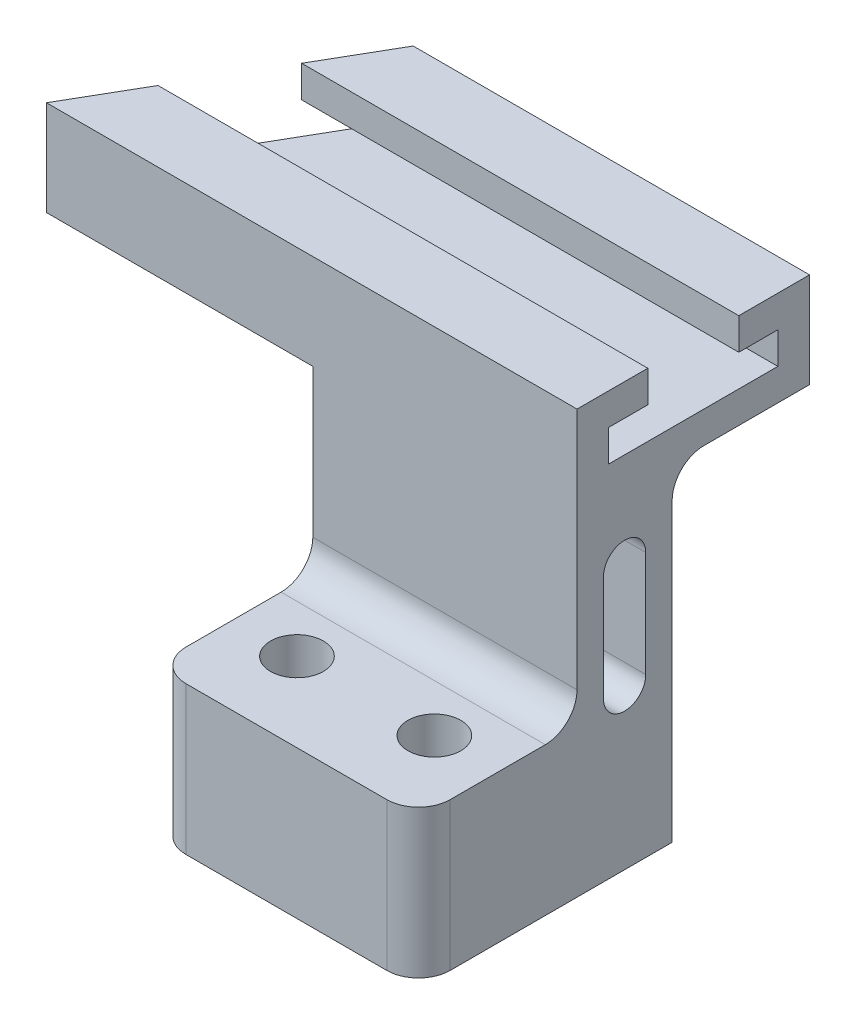
ISO-10303-21;
HEADER;
FILE_DESCRIPTION(('STEP AP214'),'2;1');
FILE_NAME('part.step','',(''),(''),'','','');
FILE_SCHEMA(('AUTOMOTIVE_DESIGN { 1 0 10303 214 1 1 1 1 }'));
ENDSEC;
DATA;
#1=APPLICATION_CONTEXT('core data for automotive mechanical design processes');
#2=APPLICATION_PROTOCOL_DEFINITION('international standard','automotive_design',2000,#1);
#3=PRODUCT_CONTEXT('',#1,'mechanical');
#4=PRODUCT('Part','Part','',(#3));
#5=PRODUCT_RELATED_PRODUCT_CATEGORY('part','',(#4));
#6=PRODUCT_DEFINITION_FORMATION('','',#4);
#7=PRODUCT_DEFINITION_CONTEXT('part definition',#1,'design');
#8=PRODUCT_DEFINITION('design','',#6,#7);
#9=PRODUCT_DEFINITION_SHAPE('','',#8);
#10=(LENGTH_UNIT() NAMED_UNIT(*) SI_UNIT(.MILLI.,.METRE.));
#11=(NAMED_UNIT(*) PLANE_ANGLE_UNIT() SI_UNIT($,.RADIAN.));
#12=(NAMED_UNIT(*) SI_UNIT($,.STERADIAN.) SOLID_ANGLE_UNIT());
#13=UNCERTAINTY_MEASURE_WITH_UNIT(LENGTH_MEASURE(1.E-05),#10,'distance_accuracy_value','');
#14=(GEOMETRIC_REPRESENTATION_CONTEXT(3) GLOBAL_UNCERTAINTY_ASSIGNED_CONTEXT((#13)) GLOBAL_UNIT_ASSIGNED_CONTEXT((#10,
#11,#12)) REPRESENTATION_CONTEXT('',''));
#15=CARTESIAN_POINT('',(0.,0.,0.));
#16=DIRECTION('',(0.,0.,1.));
#17=DIRECTION('',(1.,0.,0.));
#18=AXIS2_PLACEMENT_3D('',#15,#16,#17);
#19=CARTESIAN_POINT('',(-110.,80.,-30.));
#20=DIRECTION('',(0.,0.,1.));
#21=DIRECTION('',(0.,-1.,0.));
#22=AXIS2_PLACEMENT_3D('',#19,#20,#21);
#23=PLANE('',#22);
#24=DIRECTION('',(0.,1.,0.));
#25=VECTOR('',#24,1.);
#26=CARTESIAN_POINT('',(-50.,80.,-30.));
#27=LINE('',#26,#25);
#28=CARTESIAN_POINT('',(-50.,34.,-30.));
#29=VERTEX_POINT('',#28);
#30=CARTESIAN_POINT('',(-50.,62.,-30.));
#31=VERTEX_POINT('',#30);
#32=EDGE_CURVE('E271',#29,#31,#27,.T.);
#33=ORIENTED_EDGE('',*,*,#32,.F.);
#34=DIRECTION('',(1.,0.,0.));
#35=VECTOR('',#34,1.);
#36=CARTESIAN_POINT('',(-110.,34.,-30.));
#37=LINE('',#36,#35);
#38=CARTESIAN_POINT('',(0.,34.,-30.));
#39=VERTEX_POINT('',#38);
#40=EDGE_CURVE('E386',#29,#39,#37,.T.);
#41=ORIENTED_EDGE('',*,*,#40,.T.);
#42=DIRECTION('',(0.,-1.,0.));
#43=VECTOR('',#42,1.);
#44=CARTESIAN_POINT('',(0.,80.,-30.));
#45=LINE('',#44,#43);
#46=CARTESIAN_POINT('',(0.,80.,-30.));
#47=VERTEX_POINT('',#46);
#48=EDGE_CURVE('E381',#47,#39,#45,.T.);
#49=ORIENTED_EDGE('',*,*,#48,.F.);
#50=DIRECTION('',(1.,0.,0.));
#51=VECTOR('',#50,1.);
#52=CARTESIAN_POINT('',(-110.,80.,-30.));
#53=LINE('',#52,#51);
#54=CARTESIAN_POINT('',(-100.403411844344,80.,-30.));
#55=VERTEX_POINT('',#54);
#56=EDGE_CURVE('E388',#55,#47,#53,.T.);
#57=ORIENTED_EDGE('',*,*,#56,.F.);
#58=DIRECTION('',(0.,1.,0.));
#59=VECTOR('',#58,1.);
#60=CARTESIAN_POINT('',(-100.403411844344,0.,-30.));
#61=LINE('',#60,#59);
#62=CARTESIAN_POINT('',(-100.403411844344,62.,-30.));
#63=VERTEX_POINT('',#62);
#64=EDGE_CURVE('E294',#63,#55,#61,.T.);
#65=ORIENTED_EDGE('',*,*,#64,.F.);
#66=DIRECTION('',(-1.,0.,0.));
#67=VECTOR('',#66,1.);
#68=CARTESIAN_POINT('',(-110.,62.,-30.));
#69=LINE('',#68,#67);
#70=EDGE_CURVE('E222',#31,#63,#69,.T.);
#71=ORIENTED_EDGE('',*,*,#70,.F.);
#72=EDGE_LOOP('',(#33,#41,#49,#57,#65,#71));
#73=FACE_BOUND('',#72,.T.);
#74=ADVANCED_FACE('F32',(#73),#23,.T.);
#75=CARTESIAN_POINT('',(-110.,80.,-43.3846153846154));
#76=DIRECTION('',(0.,1.,0.));
#77=DIRECTION('',(0.,0.,1.));
#78=AXIS2_PLACEMENT_3D('',#75,#76,#77);
#79=PLANE('',#78);
#80=DIRECTION('',(1.,0.,0.));
#81=VECTOR('',#80,1.);
#82=CARTESIAN_POINT('',(-110.,80.,-43.3846153846154));
#83=LINE('',#82,#81);
#84=CARTESIAN_POINT('',(-92.6758005490364,80.,-43.3846153846154));
#85=VERTEX_POINT('',#84);
#86=CARTESIAN_POINT('',(0.,80.,-43.3846153846154));
#87=VERTEX_POINT('',#86);
#88=EDGE_CURVE('E390',#85,#87,#83,.T.);
#89=ORIENTED_EDGE('',*,*,#88,.F.);
#90=DIRECTION('',(-0.500000000000004,0.,0.866025403784436));
#91=VECTOR('',#90,1.);
#92=CARTESIAN_POINT('',(-88.2929399400241,80.,-50.9759526419169));
#93=LINE('',#92,#91);
#94=EDGE_CURVE('E290',#85,#55,#93,.T.);
#95=ORIENTED_EDGE('',*,*,#94,.T.);
#96=ORIENTED_EDGE('',*,*,#56,.T.);
#97=DIRECTION('',(0.,0.,1.));
#98=VECTOR('',#97,1.);
#99=CARTESIAN_POINT('',(0.,80.,-43.3846153846154));
#100=LINE('',#99,#98);
#101=EDGE_CURVE('E378',#87,#47,#100,.T.);
#102=ORIENTED_EDGE('',*,*,#101,.F.);
#103=EDGE_LOOP('',(#89,#95,#96,#102));
#104=FACE_BOUND('',#103,.T.);
#105=ADVANCED_FACE('F457',(#104),#79,.T.);
#106=CARTESIAN_POINT('',(-110.,74.,-43.3846153846154));
#107=DIRECTION('',(0.,0.,-1.));
#108=DIRECTION('',(-1.,0.,0.));
#109=AXIS2_PLACEMENT_3D('',#106,#107,#108);
#110=PLANE('',#109);
#111=DIRECTION('',(1.,0.,0.));
#112=VECTOR('',#111,1.);
#113=CARTESIAN_POINT('',(-110.,74.,-43.3846153846154));
#114=LINE('',#113,#112);
#115=CARTESIAN_POINT('',(-92.6758005490364,74.,-43.3846153846154));
#116=VERTEX_POINT('',#115);
#117=CARTESIAN_POINT('',(0.,74.,-43.3846153846154));
#118=VERTEX_POINT('',#117);
#119=EDGE_CURVE('E392',#116,#118,#114,.T.);
#120=ORIENTED_EDGE('',*,*,#119,.F.);
#121=DIRECTION('',(0.,1.,0.));
#122=VECTOR('',#121,1.);
#123=CARTESIAN_POINT('',(-92.6758005490364,74.,-43.3846153846154));
#124=LINE('',#123,#122);
#125=EDGE_CURVE('E320',#116,#85,#124,.T.);
#126=ORIENTED_EDGE('',*,*,#125,.T.);
#127=ORIENTED_EDGE('',*,*,#88,.T.);
#128=DIRECTION('',(0.,1.,0.));
#129=VECTOR('',#128,1.);
#130=CARTESIAN_POINT('',(0.,74.,-43.3846153846154));
#131=LINE('',#130,#129);
#132=EDGE_CURVE('E375',#118,#87,#131,.T.);
#133=ORIENTED_EDGE('',*,*,#132,.F.);
#134=EDGE_LOOP('',(#120,#126,#127,#133));
#135=FACE_BOUND('',#134,.T.);
#136=ADVANCED_FACE('F452',(#135),#110,.T.);
#137=CARTESIAN_POINT('',(-110.,74.,-36.));
#138=DIRECTION('',(0.,-1.,0.));
#139=DIRECTION('',(0.,0.,-1.));
#140=AXIS2_PLACEMENT_3D('',#137,#138,#139);
#141=PLANE('',#140);
#142=DIRECTION('',(1.,0.,0.));
#143=VECTOR('',#142,1.);
#144=CARTESIAN_POINT('',(-110.,74.,-36.));
#145=LINE('',#144,#143);
#146=CARTESIAN_POINT('',(-96.939310229206,74.,-36.));
#147=VERTEX_POINT('',#146);
#148=CARTESIAN_POINT('',(0.,74.,-36.));
#149=VERTEX_POINT('',#148);
#150=EDGE_CURVE('E394',#147,#149,#145,.T.);
#151=ORIENTED_EDGE('',*,*,#150,.F.);
#152=DIRECTION('',(0.500000000000004,0.,-0.866025403784436));
#153=VECTOR('',#152,1.);
#154=CARTESIAN_POINT('',(-100.204482671905,74.,-30.3445554337724));
#155=LINE('',#154,#153);
#156=EDGE_CURVE('E317',#147,#116,#155,.T.);
#157=ORIENTED_EDGE('',*,*,#156,.T.);
#158=ORIENTED_EDGE('',*,*,#119,.T.);
#159=DIRECTION('',(0.,0.,-1.));
#160=VECTOR('',#159,1.);
#161=CARTESIAN_POINT('',(0.,74.,-36.));
#162=LINE('',#161,#160);
#163=EDGE_CURVE('E372',#149,#118,#162,.T.);
#164=ORIENTED_EDGE('',*,*,#163,.F.);
#165=EDGE_LOOP('',(#151,#157,#158,#164));
#166=FACE_BOUND('',#165,.T.);
#167=ADVANCED_FACE('F448',(#166),#141,.T.);
#168=CARTESIAN_POINT('',(-110.,68.,-36.));
#169=DIRECTION('',(0.,0.,-1.));
#170=DIRECTION('',(-1.,0.,0.));
#171=AXIS2_PLACEMENT_3D('',#168,#169,#170);
#172=PLANE('',#171);
#173=DIRECTION('',(1.,0.,0.));
#174=VECTOR('',#173,1.);
#175=CARTESIAN_POINT('',(-110.,68.,-36.));
#176=LINE('',#175,#174);
#177=CARTESIAN_POINT('',(-96.939310229206,68.,-36.));
#178=VERTEX_POINT('',#177);
#179=CARTESIAN_POINT('',(0.,68.,-36.));
#180=VERTEX_POINT('',#179);
#181=EDGE_CURVE('E396',#178,#180,#176,.T.);
#182=ORIENTED_EDGE('',*,*,#181,.F.);
#183=DIRECTION('',(0.,1.,0.));
#184=VECTOR('',#183,1.);
#185=CARTESIAN_POINT('',(-96.939310229206,68.,-36.));
#186=LINE('',#185,#184);
#187=EDGE_CURVE('E314',#178,#147,#186,.T.);
#188=ORIENTED_EDGE('',*,*,#187,.T.);
#189=ORIENTED_EDGE('',*,*,#150,.T.);
#190=DIRECTION('',(0.,1.,0.));
#191=VECTOR('',#190,1.);
#192=CARTESIAN_POINT('',(0.,68.,-36.));
#193=LINE('',#192,#191);
#194=EDGE_CURVE('E369',#180,#149,#193,.T.);
#195=ORIENTED_EDGE('',*,*,#194,.F.);
#196=EDGE_LOOP('',(#182,#188,#189,#195));
#197=FACE_BOUND('',#196,.T.);
#198=ADVANCED_FACE('F445',(#197),#172,.T.);
#199=CARTESIAN_POINT('',(-110.,68.,-68.));
#200=DIRECTION('',(0.,1.,0.));
#201=DIRECTION('',(0.,0.,1.));
#202=AXIS2_PLACEMENT_3D('',#199,#200,#201);
#203=PLANE('',#202);
#204=DIRECTION('',(1.,0.,0.));
#205=VECTOR('',#204,1.);
#206=CARTESIAN_POINT('',(-110.,68.,-68.));
#207=LINE('',#206,#205);
#208=CARTESIAN_POINT('',(-78.4641016151378,68.,-68.));
#209=VERTEX_POINT('',#208);
#210=CARTESIAN_POINT('',(0.,68.,-68.));
#211=VERTEX_POINT('',#210);
#212=EDGE_CURVE('E398',#209,#211,#207,.T.);
#213=ORIENTED_EDGE('',*,*,#212,.F.);
#214=DIRECTION('',(-0.500000000000004,0.,0.866025403784436));
#215=VECTOR('',#214,1.);
#216=CARTESIAN_POINT('',(-86.3480762113535,68.,-54.3445554337723));
#217=LINE('',#216,#215);
#218=EDGE_CURVE('E311',#209,#178,#217,.T.);
#219=ORIENTED_EDGE('',*,*,#218,.T.);
#220=ORIENTED_EDGE('',*,*,#181,.T.);
#221=DIRECTION('',(0.,0.,1.));
#222=VECTOR('',#221,1.);
#223=CARTESIAN_POINT('',(0.,68.,-68.));
#224=LINE('',#223,#222);
#225=EDGE_CURVE('E366',#211,#180,#224,.T.);
#226=ORIENTED_EDGE('',*,*,#225,.F.);
#227=EDGE_LOOP('',(#213,#219,#220,#226));
#228=FACE_BOUND('',#227,.T.);
#229=ADVANCED_FACE('F440',(#228),#203,.T.);
#230=CARTESIAN_POINT('',(-110.,74.,-68.));
#231=DIRECTION('',(0.,0.,1.));
#232=DIRECTION('',(1.,0.,0.));
#233=AXIS2_PLACEMENT_3D('',#230,#231,#232);
#234=PLANE('',#233);
#235=DIRECTION('',(1.,0.,0.));
#236=VECTOR('',#235,1.);
#237=CARTESIAN_POINT('',(-110.,74.,-68.));
#238=LINE('',#237,#236);
#239=CARTESIAN_POINT('',(-78.4641016151378,74.,-68.));
#240=VERTEX_POINT('',#239);
#241=CARTESIAN_POINT('',(0.,74.,-68.));
#242=VERTEX_POINT('',#241);
#243=EDGE_CURVE('E400',#240,#242,#238,.T.);
#244=ORIENTED_EDGE('',*,*,#243,.F.);
#245=DIRECTION('',(0.,-1.,0.));
#246=VECTOR('',#245,1.);
#247=CARTESIAN_POINT('',(-78.4641016151378,74.,-68.));
#248=LINE('',#247,#246);
#249=EDGE_CURVE('E308',#240,#209,#248,.T.);
#250=ORIENTED_EDGE('',*,*,#249,.T.);
#251=ORIENTED_EDGE('',*,*,#212,.T.);
#252=DIRECTION('',(0.,-1.,0.));
#253=VECTOR('',#252,1.);
#254=CARTESIAN_POINT('',(0.,74.,-68.));
#255=LINE('',#254,#253);
#256=EDGE_CURVE('E363',#242,#211,#255,.T.);
#257=ORIENTED_EDGE('',*,*,#256,.F.);
#258=EDGE_LOOP('',(#244,#250,#251,#257));
#259=FACE_BOUND('',#258,.T.);
#260=ADVANCED_FACE('F436',(#259),#234,.T.);
#261=CARTESIAN_POINT('',(-110.,74.,-60.6153846153846));
#262=DIRECTION('',(0.,-1.,0.));
#263=DIRECTION('',(0.,0.,-1.));
#264=AXIS2_PLACEMENT_3D('',#261,#262,#263);
#265=PLANE('',#264);
#266=DIRECTION('',(1.,0.,0.));
#267=VECTOR('',#266,1.);
#268=CARTESIAN_POINT('',(-110.,74.,-60.6153846153846));
#269=LINE('',#268,#267);
#270=CARTESIAN_POINT('',(-82.7276112953074,74.,-60.6153846153846));
#271=VERTEX_POINT('',#270);
#272=CARTESIAN_POINT('',(0.,74.,-60.6153846153846));
#273=VERTEX_POINT('',#272);
#274=EDGE_CURVE('E402',#271,#273,#269,.T.);
#275=ORIENTED_EDGE('',*,*,#274,.F.);
#276=DIRECTION('',(0.500000000000004,0.,-0.866025403784436));
#277=VECTOR('',#276,1.);
#278=CARTESIAN_POINT('',(-89.5457084714807,74.,-48.8060938953107));
#279=LINE('',#278,#277);
#280=EDGE_CURVE('E305',#271,#240,#279,.T.);
#281=ORIENTED_EDGE('',*,*,#280,.T.);
#282=ORIENTED_EDGE('',*,*,#243,.T.);
#283=DIRECTION('',(0.,0.,-1.));
#284=VECTOR('',#283,1.);
#285=CARTESIAN_POINT('',(0.,74.,-60.6153846153846));
#286=LINE('',#285,#284);
#287=EDGE_CURVE('E360',#273,#242,#286,.T.);
#288=ORIENTED_EDGE('',*,*,#287,.F.);
#289=EDGE_LOOP('',(#275,#281,#282,#288));
#290=FACE_BOUND('',#289,.T.);
#291=ADVANCED_FACE('F433',(#290),#265,.T.);
#292=CARTESIAN_POINT('',(-110.,80.,-60.6153846153846));
#293=DIRECTION('',(0.,0.,1.));
#294=DIRECTION('',(1.,0.,0.));
#295=AXIS2_PLACEMENT_3D('',#292,#293,#294);
#296=PLANE('',#295);
#297=DIRECTION('',(1.,0.,0.));
#298=VECTOR('',#297,1.);
#299=CARTESIAN_POINT('',(-110.,80.,-60.6153846153846));
#300=LINE('',#299,#298);
#301=CARTESIAN_POINT('',(-82.7276112953074,80.,-60.6153846153846));
#302=VERTEX_POINT('',#301);
#303=CARTESIAN_POINT('',(0.,80.,-60.6153846153846));
#304=VERTEX_POINT('',#303);
#305=EDGE_CURVE('E404',#302,#304,#300,.T.);
#306=ORIENTED_EDGE('',*,*,#305,.F.);
#307=DIRECTION('',(0.,-1.,0.));
#308=VECTOR('',#307,1.);
#309=CARTESIAN_POINT('',(-82.7276112953074,80.,-60.6153846153846));
#310=LINE('',#309,#308);
#311=EDGE_CURVE('E302',#302,#271,#310,.T.);
#312=ORIENTED_EDGE('',*,*,#311,.T.);
#313=ORIENTED_EDGE('',*,*,#274,.T.);
#314=DIRECTION('',(0.,-1.,0.));
#315=VECTOR('',#314,1.);
#316=CARTESIAN_POINT('',(0.,80.,-60.6153846153846));
#317=LINE('',#316,#315);
#318=EDGE_CURVE('E357',#304,#273,#317,.T.);
#319=ORIENTED_EDGE('',*,*,#318,.F.);
#320=EDGE_LOOP('',(#306,#312,#313,#319));
#321=FACE_BOUND('',#320,.T.);
#322=ADVANCED_FACE('F428',(#321),#296,.T.);
#323=CARTESIAN_POINT('',(-110.,80.,-74.));
#324=DIRECTION('',(0.,1.,0.));
#325=DIRECTION('',(0.,0.,1.));
#326=AXIS2_PLACEMENT_3D('',#323,#324,#325);
#327=PLANE('',#326);
#328=DIRECTION('',(1.,0.,0.));
#329=VECTOR('',#328,1.);
#330=CARTESIAN_POINT('',(-110.,80.,-74.));
#331=LINE('',#330,#329);
#332=CARTESIAN_POINT('',(-75.,80.,-74.));
#333=VERTEX_POINT('',#332);
#334=CARTESIAN_POINT('',(0.,80.,-74.));
#335=VERTEX_POINT('',#334);
#336=EDGE_CURVE('E406',#333,#335,#331,.T.);
#337=ORIENTED_EDGE('',*,*,#336,.F.);
#338=EDGE_CURVE('E291',#333,#302,#93,.T.);
#339=ORIENTED_EDGE('',*,*,#338,.T.);
#340=ORIENTED_EDGE('',*,*,#305,.T.);
#341=DIRECTION('',(0.,0.,1.));
#342=VECTOR('',#341,1.);
#343=CARTESIAN_POINT('',(0.,80.,-74.));
#344=LINE('',#343,#342);
#345=EDGE_CURVE('E354',#335,#304,#344,.T.);
#346=ORIENTED_EDGE('',*,*,#345,.F.);
#347=EDGE_LOOP('',(#337,#339,#340,#346));
#348=FACE_BOUND('',#347,.T.);
#349=ADVANCED_FACE('F424',(#348),#327,.T.);
#350=CARTESIAN_POINT('',(-110.,62.,-74.));
#351=DIRECTION('',(0.,0.,-1.));
#352=DIRECTION('',(-1.,0.,0.));
#353=AXIS2_PLACEMENT_3D('',#350,#351,#352);
#354=PLANE('',#353);
#355=DIRECTION('',(1.,0.,0.));
#356=VECTOR('',#355,1.);
#357=CARTESIAN_POINT('',(-110.,62.,-74.));
#358=LINE('',#357,#356);
#359=CARTESIAN_POINT('',(-75.,62.,-74.));
#360=VERTEX_POINT('',#359);
#361=CARTESIAN_POINT('',(0.,62.,-74.));
#362=VERTEX_POINT('',#361);
#363=EDGE_CURVE('E408',#360,#362,#358,.T.);
#364=ORIENTED_EDGE('',*,*,#363,.F.);
#365=DIRECTION('',(0.,1.,0.));
#366=VECTOR('',#365,1.);
#367=CARTESIAN_POINT('',(-75.,0.,-74.));
#368=LINE('',#367,#366);
#369=EDGE_CURVE('E295',#360,#333,#368,.T.);
#370=ORIENTED_EDGE('',*,*,#369,.T.);
#371=ORIENTED_EDGE('',*,*,#336,.T.);
#372=DIRECTION('',(0.,1.,0.));
#373=VECTOR('',#372,1.);
#374=CARTESIAN_POINT('',(0.,62.,-74.));
#375=LINE('',#374,#373);
#376=EDGE_CURVE('E351',#362,#335,#375,.T.);
#377=ORIENTED_EDGE('',*,*,#376,.F.);
#378=EDGE_LOOP('',(#364,#370,#371,#377));
#379=FACE_BOUND('',#378,.T.);
#380=ADVANCED_FACE('F421',(#379),#354,.T.);
#381=CARTESIAN_POINT('',(-110.,62.,-54.));
#382=DIRECTION('',(0.,-1.,0.));
#383=DIRECTION('',(0.,0.,-1.));
#384=AXIS2_PLACEMENT_3D('',#381,#382,#383);
#385=PLANE('',#384);
#386=DIRECTION('',(1.,0.,0.));
#387=VECTOR('',#386,1.);
#388=CARTESIAN_POINT('',(-110.,62.,-54.));
#389=LINE('',#388,#387);
#390=CARTESIAN_POINT('',(-50.,62.,-54.));
#391=VERTEX_POINT('',#390);
#392=CARTESIAN_POINT('',(0.,62.,-54.));
#393=VERTEX_POINT('',#392);
#394=EDGE_CURVE('E231',#391,#393,#389,.T.);
#395=ORIENTED_EDGE('',*,*,#394,.F.);
#396=DIRECTION('',(0.,0.,1.));
#397=VECTOR('',#396,1.);
#398=CARTESIAN_POINT('',(-50.,62.,-74.));
#399=LINE('',#398,#397);
#400=EDGE_CURVE('E223',#391,#31,#399,.T.);
#401=ORIENTED_EDGE('',*,*,#400,.T.);
#402=ORIENTED_EDGE('',*,*,#70,.T.);
#403=DIRECTION('',(0.500000000000004,0.,-0.866025403784436));
#404=VECTOR('',#403,1.);
#405=CARTESIAN_POINT('',(-92.4102540378446,62.,-43.8445554337723));
#406=LINE('',#405,#404);
#407=EDGE_CURVE('E298',#63,#360,#406,.T.);
#408=ORIENTED_EDGE('',*,*,#407,.T.);
#409=ORIENTED_EDGE('',*,*,#363,.T.);
#410=DIRECTION('',(0.,0.,-1.));
#411=VECTOR('',#410,1.);
#412=CARTESIAN_POINT('',(0.,62.,-54.));
#413=LINE('',#412,#411);
#414=EDGE_CURVE('E348',#393,#362,#413,.T.);
#415=ORIENTED_EDGE('',*,*,#414,.F.);
#416=EDGE_LOOP('',(#395,#401,#402,#408,#409,#415));
#417=FACE_BOUND('',#416,.T.);
#418=ADVANCED_FACE('F416',(#417),#385,.T.);
#419=CARTESIAN_POINT('',(-110.,56.,-54.));
#420=DIRECTION('',(1.,0.,0.));
#421=DIRECTION('',(0.,0.,-1.));
#422=AXIS2_PLACEMENT_3D('',#419,#420,#421);
#423=CYLINDRICAL_SURFACE('',#422,6.);
#424=CARTESIAN_POINT('',(-50.,56.,-54.));
#425=DIRECTION('',(1.,0.,0.));
#426=DIRECTION('',(0.,0.,-1.));
#427=AXIS2_PLACEMENT_3D('',#424,#425,#426);
#428=CIRCLE('',#427,6.);
#429=CARTESIAN_POINT('',(-50.,56.,-48.));
#430=VERTEX_POINT('',#429);
#431=EDGE_CURVE('E207',#391,#430,#428,.T.);
#432=ORIENTED_EDGE('',*,*,#431,.F.);
#433=ORIENTED_EDGE('',*,*,#394,.T.);
#434=CARTESIAN_POINT('',(0.,56.,-54.));
#435=DIRECTION('',(-1.,0.,0.));
#436=DIRECTION('',(0.,0.,1.));
#437=AXIS2_PLACEMENT_3D('',#434,#435,#436);
#438=CIRCLE('',#437,6.);
#439=CARTESIAN_POINT('',(0.,56.,-48.));
#440=VERTEX_POINT('',#439);
#441=EDGE_CURVE('E345',#440,#393,#438,.T.);
#442=ORIENTED_EDGE('',*,*,#441,.F.);
#443=DIRECTION('',(1.,0.,0.));
#444=VECTOR('',#443,1.);
#445=CARTESIAN_POINT('',(-110.,56.,-48.));
#446=LINE('',#445,#444);
#447=EDGE_CURVE('E228',#430,#440,#446,.T.);
#448=ORIENTED_EDGE('',*,*,#447,.F.);
#449=EDGE_LOOP('',(#432,#433,#442,#448));
#450=FACE_BOUND('',#449,.T.);
#451=ADVANCED_FACE('F413',(#450),#423,.F.);
#452=CARTESIAN_POINT('',(-110.,0.,-48.));
#453=DIRECTION('',(0.,0.,-1.));
#454=DIRECTION('',(-1.,0.,0.));
#455=AXIS2_PLACEMENT_3D('',#452,#453,#454);
#456=PLANE('',#455);
#457=DIRECTION('',(0.,-1.,0.));
#458=VECTOR('',#457,1.);
#459=CARTESIAN_POINT('',(-50.,0.,-48.));
#460=LINE('',#459,#458);
#461=CARTESIAN_POINT('',(-50.,0.,-48.));
#462=VERTEX_POINT('',#461);
#463=EDGE_CURVE('E201',#430,#462,#460,.T.);
#464=ORIENTED_EDGE('',*,*,#463,.F.);
#465=ORIENTED_EDGE('',*,*,#447,.T.);
#466=DIRECTION('',(0.,1.,0.));
#467=VECTOR('',#466,1.);
#468=CARTESIAN_POINT('',(0.,0.,-48.));
#469=LINE('',#468,#467);
#470=CARTESIAN_POINT('',(0.,0.,-48.));
#471=VERTEX_POINT('',#470);
#472=EDGE_CURVE('E227',#471,#440,#469,.T.);
#473=ORIENTED_EDGE('',*,*,#472,.F.);
#474=DIRECTION('',(1.,0.,0.));
#475=VECTOR('',#474,1.);
#476=CARTESIAN_POINT('',(-110.,0.,-48.));
#477=LINE('',#476,#475);
#478=EDGE_CURVE('E217',#462,#471,#477,.T.);
#479=ORIENTED_EDGE('',*,*,#478,.F.);
#480=EDGE_LOOP('',(#464,#465,#473,#479));
#481=FACE_BOUND('',#480,.T.);
#482=ADVANCED_FACE('F225',(#481),#456,.T.);
#483=CARTESIAN_POINT('',(-110.,0.,0.));
#484=DIRECTION('',(0.,-1.,0.));
#485=DIRECTION('',(0.,0.,-1.));
#486=AXIS2_PLACEMENT_3D('',#483,#484,#485);
#487=PLANE('',#486);
#488=CARTESIAN_POINT('',(-38.,0.,-15.));
#489=DIRECTION('',(0.,1.,0.));
#490=DIRECTION('',(0.,0.,1.));
#491=AXIS2_PLACEMENT_3D('',#488,#489,#490);
#492=CIRCLE('',#491,5.);
#493=CARTESIAN_POINT('',(-38.,0.,-10.));
#494=VERTEX_POINT('',#493);
#495=EDGE_CURVE('E467',#494,#494,#492,.T.);
#496=ORIENTED_EDGE('',*,*,#495,.T.);
#497=EDGE_LOOP('',(#496));
#498=FACE_BOUND('',#497,.T.);
#499=CARTESIAN_POINT('',(-12.,0.,-15.));
#500=DIRECTION('',(0.,1.,0.));
#501=DIRECTION('',(0.,0.,1.));
#502=AXIS2_PLACEMENT_3D('',#499,#500,#501);
#503=CIRCLE('',#502,5.);
#504=CARTESIAN_POINT('',(-12.,0.,-10.));
#505=VERTEX_POINT('',#504);
#506=EDGE_CURVE('E540',#505,#505,#503,.T.);
#507=ORIENTED_EDGE('',*,*,#506,.T.);
#508=EDGE_LOOP('',(#507));
#509=FACE_BOUND('',#508,.T.);
#510=DIRECTION('',(0.,0.,-1.));
#511=VECTOR('',#510,1.);
#512=CARTESIAN_POINT('',(0.,0.,0.));
#513=LINE('',#512,#511);
#514=CARTESIAN_POINT('',(0.,0.,-6.));
#515=VERTEX_POINT('',#514);
#516=EDGE_CURVE('E265',#515,#471,#513,.T.);
#517=ORIENTED_EDGE('',*,*,#516,.F.);
#518=CARTESIAN_POINT('',(-6.,0.,-6.));
#519=DIRECTION('',(0.,-1.,0.));
#520=DIRECTION('',(0.,0.,-1.));
#521=AXIS2_PLACEMENT_3D('',#518,#519,#520);
#522=CIRCLE('',#521,6.);
#523=CARTESIAN_POINT('',(-6.00000000000001,0.,0.));
#524=VERTEX_POINT('',#523);
#525=EDGE_CURVE('E244',#515,#524,#522,.T.);
#526=ORIENTED_EDGE('',*,*,#525,.T.);
#527=DIRECTION('',(1.,0.,0.));
#528=VECTOR('',#527,1.);
#529=CARTESIAN_POINT('',(-110.,0.,0.));
#530=LINE('',#529,#528);
#531=CARTESIAN_POINT('',(-44.,0.,0.));
#532=VERTEX_POINT('',#531);
#533=EDGE_CURVE('E229',#532,#524,#530,.T.);
#534=ORIENTED_EDGE('',*,*,#533,.F.);
#535=CARTESIAN_POINT('',(-44.,0.,-5.99999999999999));
#536=DIRECTION('',(0.,-1.,0.));
#537=DIRECTION('',(0.,0.,-1.));
#538=AXIS2_PLACEMENT_3D('',#535,#536,#537);
#539=CIRCLE('',#538,6.);
#540=CARTESIAN_POINT('',(-50.,0.,-5.99999999999999));
#541=VERTEX_POINT('',#540);
#542=EDGE_CURVE('E221',#532,#541,#539,.T.);
#543=ORIENTED_EDGE('',*,*,#542,.T.);
#544=DIRECTION('',(0.,0.,1.));
#545=VECTOR('',#544,1.);
#546=CARTESIAN_POINT('',(-50.,0.,-74.));
#547=LINE('',#546,#545);
#548=EDGE_CURVE('E205',#462,#541,#547,.T.);
#549=ORIENTED_EDGE('',*,*,#548,.F.);
#550=ORIENTED_EDGE('',*,*,#478,.T.);
#551=EDGE_LOOP('',(#517,#526,#534,#543,#549,#550));
#552=FACE_BOUND('',#551,.T.);
#553=ADVANCED_FACE('F216',(#498,#509,#552),#487,.T.);
#554=CARTESIAN_POINT('',(-110.,50.,-39.));
#555=DIRECTION('',(1.,0.,0.));
#556=DIRECTION('',(0.,0.,-1.));
#557=AXIS2_PLACEMENT_3D('',#554,#555,#556);
#558=CYLINDRICAL_SURFACE('',#557,4.);
#559=DIRECTION('',(1.,0.,0.));
#560=VECTOR('',#559,1.);
#561=CARTESIAN_POINT('',(-110.,50.,-35.));
#562=LINE('',#561,#560);
#563=CARTESIAN_POINT('',(-50.,50.,-35.));
#564=VERTEX_POINT('',#563);
#565=CARTESIAN_POINT('',(0.,50.,-35.));
#566=VERTEX_POINT('',#565);
#567=EDGE_CURVE('E335',#564,#566,#562,.T.);
#568=ORIENTED_EDGE('',*,*,#567,.F.);
#569=CARTESIAN_POINT('',(-50.,50.,-39.));
#570=DIRECTION('',(1.,0.,0.));
#571=DIRECTION('',(0.,0.,-1.));
#572=AXIS2_PLACEMENT_3D('',#569,#570,#571);
#573=CIRCLE('',#572,4.);
#574=CARTESIAN_POINT('',(-50.,50.,-43.));
#575=VERTEX_POINT('',#574);
#576=EDGE_CURVE('E211',#564,#575,#573,.F.);
#577=ORIENTED_EDGE('',*,*,#576,.T.);
#578=DIRECTION('',(1.,0.,0.));
#579=VECTOR('',#578,1.);
#580=CARTESIAN_POINT('',(-110.,50.,-43.));
#581=LINE('',#580,#579);
#582=CARTESIAN_POINT('',(0.,50.,-43.));
#583=VERTEX_POINT('',#582);
#584=EDGE_CURVE('E336',#575,#583,#581,.T.);
#585=ORIENTED_EDGE('',*,*,#584,.T.);
#586=CARTESIAN_POINT('',(0.,50.,-39.));
#587=DIRECTION('',(1.,0.,0.));
#588=DIRECTION('',(0.,0.,-1.));
#589=AXIS2_PLACEMENT_3D('',#586,#587,#588);
#590=CIRCLE('',#589,4.);
#591=EDGE_CURVE('E323',#583,#566,#590,.T.);
#592=ORIENTED_EDGE('',*,*,#591,.T.);
#593=EDGE_LOOP('',(#568,#577,#585,#592));
#594=FACE_BOUND('',#593,.T.);
#595=ADVANCED_FACE('F516',(#594),#558,.F.);
#596=CARTESIAN_POINT('',(-110.,50.,-43.));
#597=DIRECTION('',(0.,0.,-1.));
#598=DIRECTION('',(-1.,0.,0.));
#599=AXIS2_PLACEMENT_3D('',#596,#597,#598);
#600=PLANE('',#599);
#601=ORIENTED_EDGE('',*,*,#584,.F.);
#602=DIRECTION('',(0.,-1.,0.));
#603=VECTOR('',#602,1.);
#604=CARTESIAN_POINT('',(-50.,50.,-43.));
#605=LINE('',#604,#603);
#606=CARTESIAN_POINT('',(-50.,30.,-43.));
#607=VERTEX_POINT('',#606);
#608=EDGE_CURVE('E284',#575,#607,#605,.T.);
#609=ORIENTED_EDGE('',*,*,#608,.T.);
#610=DIRECTION('',(1.,0.,0.));
#611=VECTOR('',#610,1.);
#612=CARTESIAN_POINT('',(-110.,30.,-43.));
#613=LINE('',#612,#611);
#614=CARTESIAN_POINT('',(0.,30.,-43.));
#615=VERTEX_POINT('',#614);
#616=EDGE_CURVE('E338',#607,#615,#613,.T.);
#617=ORIENTED_EDGE('',*,*,#616,.T.);
#618=DIRECTION('',(0.,1.,0.));
#619=VECTOR('',#618,1.);
#620=CARTESIAN_POINT('',(0.,50.,-43.));
#621=LINE('',#620,#619);
#622=EDGE_CURVE('E332',#615,#583,#621,.T.);
#623=ORIENTED_EDGE('',*,*,#622,.T.);
#624=EDGE_LOOP('',(#601,#609,#617,#623));
#625=FACE_BOUND('',#624,.T.);
#626=ADVANCED_FACE('F558',(#625),#600,.F.);
#627=CARTESIAN_POINT('',(-110.,30.,-39.));
#628=DIRECTION('',(1.,0.,0.));
#629=DIRECTION('',(0.,0.,-1.));
#630=AXIS2_PLACEMENT_3D('',#627,#628,#629);
#631=CYLINDRICAL_SURFACE('',#630,3.99999999999999);
#632=ORIENTED_EDGE('',*,*,#616,.F.);
#633=CARTESIAN_POINT('',(-50.,30.,-39.));
#634=DIRECTION('',(1.,0.,0.));
#635=DIRECTION('',(0.,0.,-1.));
#636=AXIS2_PLACEMENT_3D('',#633,#634,#635);
#637=CIRCLE('',#636,3.99999999999999);
#638=CARTESIAN_POINT('',(-50.,30.,-35.));
#639=VERTEX_POINT('',#638);
#640=EDGE_CURVE('E281',#607,#639,#637,.F.);
#641=ORIENTED_EDGE('',*,*,#640,.T.);
#642=DIRECTION('',(1.,0.,0.));
#643=VECTOR('',#642,1.);
#644=CARTESIAN_POINT('',(-110.,30.,-35.));
#645=LINE('',#644,#643);
#646=CARTESIAN_POINT('',(0.,30.,-35.));
#647=VERTEX_POINT('',#646);
#648=EDGE_CURVE('E340',#639,#647,#645,.T.);
#649=ORIENTED_EDGE('',*,*,#648,.T.);
#650=CARTESIAN_POINT('',(0.,30.,-39.));
#651=DIRECTION('',(1.,0.,0.));
#652=DIRECTION('',(0.,0.,-1.));
#653=AXIS2_PLACEMENT_3D('',#650,#651,#652);
#654=CIRCLE('',#653,3.99999999999999);
#655=EDGE_CURVE('E329',#647,#615,#654,.T.);
#656=ORIENTED_EDGE('',*,*,#655,.T.);
#657=EDGE_LOOP('',(#632,#641,#649,#656));
#658=FACE_BOUND('',#657,.T.);
#659=ADVANCED_FACE('F562',(#658),#631,.F.);
#660=CARTESIAN_POINT('',(-110.,50.,-35.));
#661=DIRECTION('',(0.,0.,1.));
#662=DIRECTION('',(0.,-1.,0.));
#663=AXIS2_PLACEMENT_3D('',#660,#661,#662);
#664=PLANE('',#663);
#665=ORIENTED_EDGE('',*,*,#648,.F.);
#666=DIRECTION('',(0.,1.,0.));
#667=VECTOR('',#666,1.);
#668=CARTESIAN_POINT('',(-50.,50.,-35.));
#669=LINE('',#668,#667);
#670=EDGE_CURVE('E273',#639,#564,#669,.T.);
#671=ORIENTED_EDGE('',*,*,#670,.T.);
#672=ORIENTED_EDGE('',*,*,#567,.T.);
#673=DIRECTION('',(0.,-1.,0.));
#674=VECTOR('',#673,1.);
#675=CARTESIAN_POINT('',(0.,50.,-35.));
#676=LINE('',#675,#674);
#677=EDGE_CURVE('E326',#566,#647,#676,.T.);
#678=ORIENTED_EDGE('',*,*,#677,.T.);
#679=EDGE_LOOP('',(#665,#671,#672,#678));
#680=FACE_BOUND('',#679,.T.);
#681=ADVANCED_FACE('F519',(#680),#664,.F.);
#682=CARTESIAN_POINT('',(-110.,28.,0.));
#683=DIRECTION('',(0.,0.,1.));
#684=DIRECTION('',(0.,-1.,0.));
#685=AXIS2_PLACEMENT_3D('',#682,#683,#684);
#686=PLANE('',#685);
#687=ORIENTED_EDGE('',*,*,#533,.T.);
#688=DIRECTION('',(0.,-1.,0.));
#689=VECTOR('',#688,1.);
#690=CARTESIAN_POINT('',(-6.,28.,0.));
#691=LINE('',#690,#689);
#692=CARTESIAN_POINT('',(-6.00000000000001,28.,0.));
#693=VERTEX_POINT('',#692);
#694=EDGE_CURVE('E54',#524,#693,#691,.F.);
#695=ORIENTED_EDGE('',*,*,#694,.T.);
#696=DIRECTION('',(1.,0.,0.));
#697=VECTOR('',#696,1.);
#698=CARTESIAN_POINT('',(-110.,28.,0.));
#699=LINE('',#698,#697);
#700=CARTESIAN_POINT('',(-44.,28.,0.));
#701=VERTEX_POINT('',#700);
#702=EDGE_CURVE('E240',#701,#693,#699,.T.);
#703=ORIENTED_EDGE('',*,*,#702,.F.);
#704=DIRECTION('',(0.,1.,0.));
#705=VECTOR('',#704,1.);
#706=CARTESIAN_POINT('',(-44.,0.,0.));
#707=LINE('',#706,#705);
#708=EDGE_CURVE('E246',#701,#532,#707,.F.);
#709=ORIENTED_EDGE('',*,*,#708,.T.);
#710=EDGE_LOOP('',(#687,#695,#703,#709));
#711=FACE_BOUND('',#710,.T.);
#712=ADVANCED_FACE('F266',(#711),#686,.T.);
#713=CARTESIAN_POINT('',(-110.,28.,-24.));
#714=DIRECTION('',(0.,1.,0.));
#715=DIRECTION('',(0.,0.,1.));
#716=AXIS2_PLACEMENT_3D('',#713,#714,#715);
#717=PLANE('',#716);
#718=CARTESIAN_POINT('',(-38.,28.,-15.));
#719=DIRECTION('',(0.,1.,0.));
#720=DIRECTION('',(0.,0.,1.));
#721=AXIS2_PLACEMENT_3D('',#718,#719,#720);
#722=CIRCLE('',#721,5.);
#723=CARTESIAN_POINT('',(-38.,28.,-10.));
#724=VERTEX_POINT('',#723);
#725=EDGE_CURVE('E538',#724,#724,#722,.T.);
#726=ORIENTED_EDGE('',*,*,#725,.F.);
#727=EDGE_LOOP('',(#726));
#728=FACE_BOUND('',#727,.T.);
#729=CARTESIAN_POINT('',(-12.,28.,-15.));
#730=DIRECTION('',(0.,1.,0.));
#731=DIRECTION('',(0.,0.,1.));
#732=AXIS2_PLACEMENT_3D('',#729,#730,#731);
#733=CIRCLE('',#732,5.);
#734=CARTESIAN_POINT('',(-12.,28.,-10.));
#735=VERTEX_POINT('',#734);
#736=EDGE_CURVE('E544',#735,#735,#733,.T.);
#737=ORIENTED_EDGE('',*,*,#736,.F.);
#738=EDGE_LOOP('',(#737));
#739=FACE_BOUND('',#738,.T.);
#740=ORIENTED_EDGE('',*,*,#702,.T.);
#741=CARTESIAN_POINT('',(-6.,28.,-6.));
#742=DIRECTION('',(0.,1.,0.));
#743=DIRECTION('',(0.,0.,1.));
#744=AXIS2_PLACEMENT_3D('',#741,#742,#743);
#745=CIRCLE('',#744,6.);
#746=CARTESIAN_POINT('',(0.,28.,-6.));
#747=VERTEX_POINT('',#746);
#748=EDGE_CURVE('E40',#693,#747,#745,.T.);
#749=ORIENTED_EDGE('',*,*,#748,.T.);
#750=DIRECTION('',(0.,0.,1.));
#751=VECTOR('',#750,1.);
#752=CARTESIAN_POINT('',(0.,28.,-24.));
#753=LINE('',#752,#751);
#754=CARTESIAN_POINT('',(0.,28.,-24.));
#755=VERTEX_POINT('',#754);
#756=EDGE_CURVE('E233',#755,#747,#753,.T.);
#757=ORIENTED_EDGE('',*,*,#756,.F.);
#758=DIRECTION('',(1.,0.,0.));
#759=VECTOR('',#758,1.);
#760=CARTESIAN_POINT('',(-110.,28.,-24.));
#761=LINE('',#760,#759);
#762=CARTESIAN_POINT('',(-50.,28.,-24.));
#763=VERTEX_POINT('',#762);
#764=EDGE_CURVE('E270',#763,#755,#761,.T.);
#765=ORIENTED_EDGE('',*,*,#764,.F.);
#766=DIRECTION('',(0.,0.,-1.));
#767=VECTOR('',#766,1.);
#768=CARTESIAN_POINT('',(-50.,28.,-24.));
#769=LINE('',#768,#767);
#770=CARTESIAN_POINT('',(-50.,28.,-5.99999999999999));
#771=VERTEX_POINT('',#770);
#772=EDGE_CURVE('E268',#771,#763,#769,.T.);
#773=ORIENTED_EDGE('',*,*,#772,.F.);
#774=CARTESIAN_POINT('',(-44.,28.,-5.99999999999999));
#775=DIRECTION('',(0.,1.,0.));
#776=DIRECTION('',(0.,0.,1.));
#777=AXIS2_PLACEMENT_3D('',#774,#775,#776);
#778=CIRCLE('',#777,6.);
#779=EDGE_CURVE('E47',#771,#701,#778,.T.);
#780=ORIENTED_EDGE('',*,*,#779,.T.);
#781=EDGE_LOOP('',(#740,#749,#757,#765,#773,#780));
#782=FACE_BOUND('',#781,.T.);
#783=ADVANCED_FACE('F253',(#728,#739,#782),#717,.T.);
#784=CARTESIAN_POINT('',(-110.,34.,-24.));
#785=DIRECTION('',(1.,0.,0.));
#786=DIRECTION('',(0.,0.,-1.));
#787=AXIS2_PLACEMENT_3D('',#784,#785,#786);
#788=CYLINDRICAL_SURFACE('',#787,6.);
#789=CARTESIAN_POINT('',(-50.,34.,-24.));
#790=DIRECTION('',(1.,0.,0.));
#791=DIRECTION('',(0.,0.,-1.));
#792=AXIS2_PLACEMENT_3D('',#789,#790,#791);
#793=CIRCLE('',#792,6.);
#794=EDGE_CURVE('E237',#763,#29,#793,.T.);
#795=ORIENTED_EDGE('',*,*,#794,.F.);
#796=ORIENTED_EDGE('',*,*,#764,.T.);
#797=CARTESIAN_POINT('',(0.,34.,-24.));
#798=DIRECTION('',(-1.,0.,0.));
#799=DIRECTION('',(0.,0.,1.));
#800=AXIS2_PLACEMENT_3D('',#797,#798,#799);
#801=CIRCLE('',#800,6.);
#802=EDGE_CURVE('E262',#39,#755,#801,.T.);
#803=ORIENTED_EDGE('',*,*,#802,.F.);
#804=ORIENTED_EDGE('',*,*,#40,.F.);
#805=EDGE_LOOP('',(#795,#796,#803,#804));
#806=FACE_BOUND('',#805,.T.);
#807=ADVANCED_FACE('F466',(#806),#788,.F.);
#808=CARTESIAN_POINT('',(0.,56.,-54.));
#809=DIRECTION('',(-1.,0.,0.));
#810=DIRECTION('',(0.,0.,1.));
#811=AXIS2_PLACEMENT_3D('',#808,#809,#810);
#812=PLANE('',#811);
#813=ORIENTED_EDGE('',*,*,#677,.F.);
#814=ORIENTED_EDGE('',*,*,#591,.F.);
#815=ORIENTED_EDGE('',*,*,#622,.F.);
#816=ORIENTED_EDGE('',*,*,#655,.F.);
#817=EDGE_LOOP('',(#813,#814,#815,#816));
#818=FACE_BOUND('',#817,.T.);
#819=ORIENTED_EDGE('',*,*,#756,.T.);
#820=DIRECTION('',(0.,-1.,0.));
#821=VECTOR('',#820,1.);
#822=CARTESIAN_POINT('',(0.,0.,-6.));
#823=LINE('',#822,#821);
#824=EDGE_CURVE('E239',#747,#515,#823,.T.);
#825=ORIENTED_EDGE('',*,*,#824,.T.);
#826=ORIENTED_EDGE('',*,*,#516,.T.);
#827=ORIENTED_EDGE('',*,*,#472,.T.);
#828=ORIENTED_EDGE('',*,*,#441,.T.);
#829=ORIENTED_EDGE('',*,*,#414,.T.);
#830=ORIENTED_EDGE('',*,*,#376,.T.);
#831=ORIENTED_EDGE('',*,*,#345,.T.);
#832=ORIENTED_EDGE('',*,*,#318,.T.);
#833=ORIENTED_EDGE('',*,*,#287,.T.);
#834=ORIENTED_EDGE('',*,*,#256,.T.);
#835=ORIENTED_EDGE('',*,*,#225,.T.);
#836=ORIENTED_EDGE('',*,*,#194,.T.);
#837=ORIENTED_EDGE('',*,*,#163,.T.);
#838=ORIENTED_EDGE('',*,*,#132,.T.);
#839=ORIENTED_EDGE('',*,*,#101,.T.);
#840=ORIENTED_EDGE('',*,*,#48,.T.);
#841=ORIENTED_EDGE('',*,*,#802,.T.);
#842=EDGE_LOOP('',(#819,#825,#826,#827,#828,#829,#830,#831,#832,#833,#834,#835,#836,#837,#838,
#839,#840,#841));
#843=FACE_BOUND('',#842,.T.);
#844=ADVANCED_FACE('F259',(#818,#843),#812,.F.);
#845=CARTESIAN_POINT('',(-88.2929399400241,0.,-50.9759526419169));
#846=DIRECTION('',(-0.866025403784436,0.,-0.500000000000004));
#847=DIRECTION('',(-0.500000000000004,0.,0.866025403784436));
#848=AXIS2_PLACEMENT_3D('',#845,#846,#847);
#849=PLANE('',#848);
#850=ORIENTED_EDGE('',*,*,#407,.F.);
#851=ORIENTED_EDGE('',*,*,#64,.T.);
#852=ORIENTED_EDGE('',*,*,#94,.F.);
#853=ORIENTED_EDGE('',*,*,#125,.F.);
#854=ORIENTED_EDGE('',*,*,#156,.F.);
#855=ORIENTED_EDGE('',*,*,#187,.F.);
#856=ORIENTED_EDGE('',*,*,#218,.F.);
#857=ORIENTED_EDGE('',*,*,#249,.F.);
#858=ORIENTED_EDGE('',*,*,#280,.F.);
#859=ORIENTED_EDGE('',*,*,#311,.F.);
#860=ORIENTED_EDGE('',*,*,#338,.F.);
#861=ORIENTED_EDGE('',*,*,#369,.F.);
#862=EDGE_LOOP('',(#850,#851,#852,#853,#854,#855,#856,#857,#858,#859,#860,#861));
#863=FACE_BOUND('',#862,.T.);
#864=ADVANCED_FACE('F469',(#863),#849,.T.);
#865=CARTESIAN_POINT('',(-50.,0.,-74.));
#866=DIRECTION('',(1.,0.,0.));
#867=DIRECTION('',(0.,0.,-1.));
#868=AXIS2_PLACEMENT_3D('',#865,#866,#867);
#869=PLANE('',#868);
#870=ORIENTED_EDGE('',*,*,#548,.T.);
#871=DIRECTION('',(0.,1.,0.));
#872=VECTOR('',#871,1.);
#873=CARTESIAN_POINT('',(-50.,28.,-5.99999999999999));
#874=LINE('',#873,#872);
#875=EDGE_CURVE('E11',#541,#771,#874,.T.);
#876=ORIENTED_EDGE('',*,*,#875,.T.);
#877=ORIENTED_EDGE('',*,*,#772,.T.);
#878=ORIENTED_EDGE('',*,*,#794,.T.);
#879=ORIENTED_EDGE('',*,*,#32,.T.);
#880=ORIENTED_EDGE('',*,*,#400,.F.);
#881=ORIENTED_EDGE('',*,*,#431,.T.);
#882=ORIENTED_EDGE('',*,*,#463,.T.);
#883=EDGE_LOOP('',(#870,#876,#877,#878,#879,#880,#881,#882));
#884=FACE_BOUND('',#883,.T.);
#885=ORIENTED_EDGE('',*,*,#670,.F.);
#886=ORIENTED_EDGE('',*,*,#640,.F.);
#887=ORIENTED_EDGE('',*,*,#608,.F.);
#888=ORIENTED_EDGE('',*,*,#576,.F.);
#889=EDGE_LOOP('',(#885,#886,#887,#888));
#890=FACE_BOUND('',#889,.T.);
#891=ADVANCED_FACE('F203',(#884,#890),#869,.F.);
#892=CARTESIAN_POINT('',(-12.,0.,-15.));
#893=DIRECTION('',(0.,1.,0.));
#894=DIRECTION('',(0.,0.,1.));
#895=AXIS2_PLACEMENT_3D('',#892,#893,#894);
#896=CYLINDRICAL_SURFACE('',#895,5.);
#897=ORIENTED_EDGE('',*,*,#506,.F.);
#898=EDGE_LOOP('',(#897));
#899=FACE_BOUND('',#898,.T.);
#900=ORIENTED_EDGE('',*,*,#736,.T.);
#901=EDGE_LOOP('',(#900));
#902=FACE_BOUND('',#901,.T.);
#903=ADVANCED_FACE('F476',(#899,#902),#896,.F.);
#904=CARTESIAN_POINT('',(-38.,0.,-15.));
#905=DIRECTION('',(0.,1.,0.));
#906=DIRECTION('',(0.,0.,1.));
#907=AXIS2_PLACEMENT_3D('',#904,#905,#906);
#908=CYLINDRICAL_SURFACE('',#907,5.);
#909=ORIENTED_EDGE('',*,*,#495,.F.);
#910=EDGE_LOOP('',(#909));
#911=FACE_BOUND('',#910,.T.);
#912=ORIENTED_EDGE('',*,*,#725,.T.);
#913=EDGE_LOOP('',(#912));
#914=FACE_BOUND('',#913,.T.);
#915=ADVANCED_FACE('F521',(#911,#914),#908,.F.);
#916=CARTESIAN_POINT('',(-6.,56.,-6.));
#917=DIRECTION('',(0.,1.,0.));
#918=DIRECTION('',(0.,0.,1.));
#919=AXIS2_PLACEMENT_3D('',#916,#917,#918);
#920=CYLINDRICAL_SURFACE('',#919,6.);
#921=ORIENTED_EDGE('',*,*,#748,.F.);
#922=ORIENTED_EDGE('',*,*,#694,.F.);
#923=ORIENTED_EDGE('',*,*,#525,.F.);
#924=ORIENTED_EDGE('',*,*,#824,.F.);
#925=EDGE_LOOP('',(#921,#922,#923,#924));
#926=FACE_BOUND('',#925,.T.);
#927=ADVANCED_FACE('F264',(#926),#920,.T.);
#928=CARTESIAN_POINT('',(-44.,0.,-5.99999999999999));
#929=DIRECTION('',(0.,-1.,0.));
#930=DIRECTION('',(0.,0.,-1.));
#931=AXIS2_PLACEMENT_3D('',#928,#929,#930);
#932=CYLINDRICAL_SURFACE('',#931,6.);
#933=ORIENTED_EDGE('',*,*,#542,.F.);
#934=ORIENTED_EDGE('',*,*,#708,.F.);
#935=ORIENTED_EDGE('',*,*,#779,.F.);
#936=ORIENTED_EDGE('',*,*,#875,.F.);
#937=EDGE_LOOP('',(#933,#934,#935,#936));
#938=FACE_BOUND('',#937,.T.);
#939=ADVANCED_FACE('F34',(#938),#932,.T.);
#940=CLOSED_SHELL('',(#74,#105,#136,#167,#198,#229,#260,#291,#322,#349,#380,#418,#451,#482,#553,
#595,#626,#659,#681,#712,#783,#807,#844,#864,#891,#903,#915,#927,#939));
#941=MANIFOLD_SOLID_BREP('B2',#940);
#942=ADVANCED_BREP_SHAPE_REPRESENTATION('',(#18,#941),#14);
#943=SHAPE_DEFINITION_REPRESENTATION(#9,#942);
ENDSEC;
END-ISO-10303-21;
